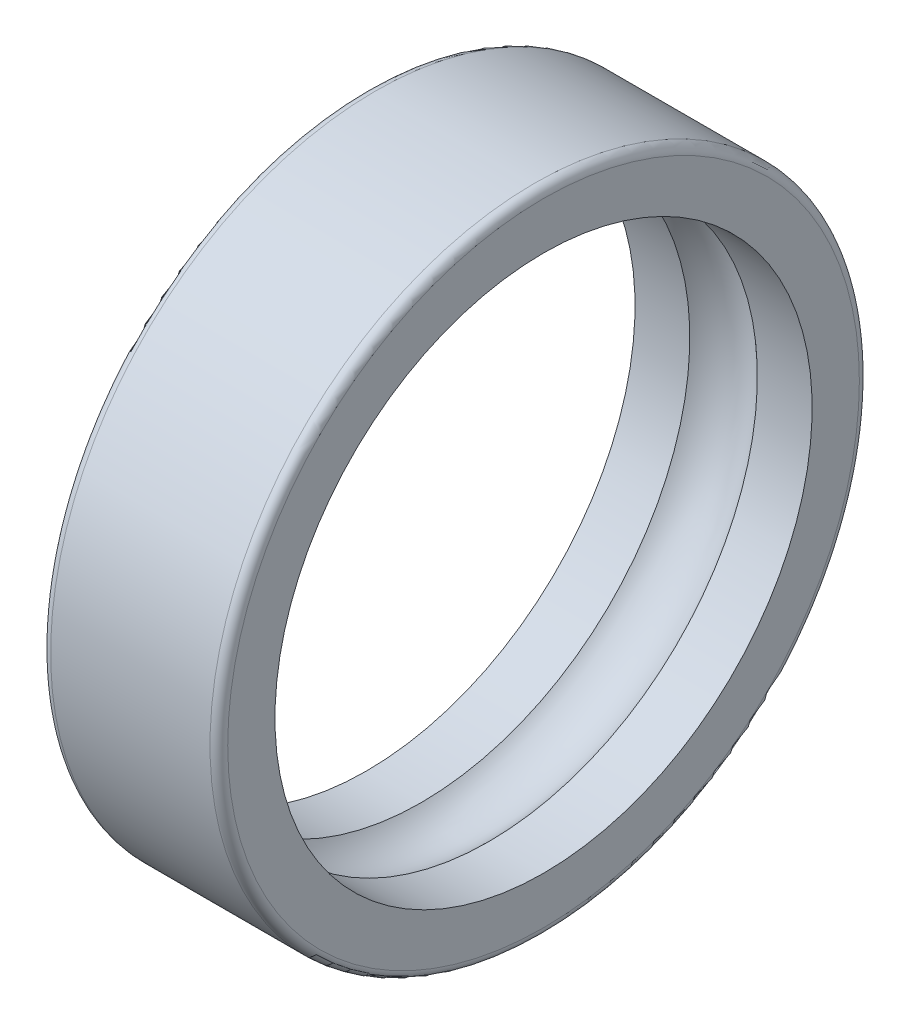
ISO-10303-21;
HEADER;
FILE_DESCRIPTION(('STEP AP214'),'2;1');
FILE_NAME('part.step','',(''),(''),'','','');
FILE_SCHEMA(('AUTOMOTIVE_DESIGN { 1 0 10303 214 1 1 1 1 }'));
ENDSEC;
DATA;
#1=APPLICATION_CONTEXT('core data for automotive mechanical design processes');
#2=APPLICATION_PROTOCOL_DEFINITION('international standard','automotive_design',2000,#1);
#3=PRODUCT_CONTEXT('',#1,'mechanical');
#4=PRODUCT('Part','Part','',(#3));
#5=PRODUCT_RELATED_PRODUCT_CATEGORY('part','',(#4));
#6=PRODUCT_DEFINITION_FORMATION('','',#4);
#7=PRODUCT_DEFINITION_CONTEXT('part definition',#1,'design');
#8=PRODUCT_DEFINITION('design','',#6,#7);
#9=PRODUCT_DEFINITION_SHAPE('','',#8);
#10=(LENGTH_UNIT() NAMED_UNIT(*) SI_UNIT(.MILLI.,.METRE.));
#11=(NAMED_UNIT(*) PLANE_ANGLE_UNIT() SI_UNIT($,.RADIAN.));
#12=(NAMED_UNIT(*) SI_UNIT($,.STERADIAN.) SOLID_ANGLE_UNIT());
#13=UNCERTAINTY_MEASURE_WITH_UNIT(LENGTH_MEASURE(1.E-05),#10,'distance_accuracy_value','');
#14=(GEOMETRIC_REPRESENTATION_CONTEXT(3) GLOBAL_UNCERTAINTY_ASSIGNED_CONTEXT((#13)) GLOBAL_UNIT_ASSIGNED_CONTEXT((#10,
#11,#12)) REPRESENTATION_CONTEXT('',''));
#15=CARTESIAN_POINT('',(0.,0.,0.));
#16=DIRECTION('',(0.,0.,1.));
#17=DIRECTION('',(1.,0.,0.));
#18=AXIS2_PLACEMENT_3D('',#15,#16,#17);
#19=CARTESIAN_POINT('',(5.07231028516007,0.,0.));
#20=DIRECTION('',(-1.,0.,0.));
#21=DIRECTION('',(0.,1.,0.));
#22=AXIS2_PLACEMENT_3D('',#19,#20,#21);
#23=CYLINDRICAL_SURFACE('',#22,9.1);
#24=CARTESIAN_POINT('',(6.,0.,0.));
#25=DIRECTION('',(1.,0.,0.));
#26=DIRECTION('',(0.,1.,0.));
#27=AXIS2_PLACEMENT_3D('',#24,#25,#26);
#28=CIRCLE('',#27,9.1);
#29=CARTESIAN_POINT('',(6.,9.1,0.));
#30=VERTEX_POINT('',#29);
#31=EDGE_CURVE('E11',#30,#30,#28,.T.);
#32=ORIENTED_EDGE('',*,*,#31,.T.);
#33=EDGE_LOOP('',(#32));
#34=FACE_BOUND('',#33,.T.);
#35=CARTESIAN_POINT('',(4.14462057032014,0.,0.));
#36=DIRECTION('',(1.,0.,0.));
#37=DIRECTION('',(0.,1.,0.));
#38=AXIS2_PLACEMENT_3D('',#35,#36,#37);
#39=CIRCLE('',#38,9.1);
#40=CARTESIAN_POINT('',(4.14462057032014,9.1,0.));
#41=VERTEX_POINT('',#40);
#42=EDGE_CURVE('E58',#41,#41,#39,.T.);
#43=ORIENTED_EDGE('',*,*,#42,.F.);
#44=EDGE_LOOP('',(#43));
#45=FACE_BOUND('',#44,.T.);
#46=ADVANCED_FACE('F16',(#34,#45),#23,.F.);
#47=CARTESIAN_POINT('',(6.,9.9,0.));
#48=DIRECTION('',(1.,0.,0.));
#49=DIRECTION('',(0.,1.,0.));
#50=AXIS2_PLACEMENT_3D('',#47,#48,#49);
#51=PLANE('',#50);
#52=CARTESIAN_POINT('',(6.,0.,0.));
#53=DIRECTION('',(1.,0.,0.));
#54=DIRECTION('',(0.,1.,0.));
#55=AXIS2_PLACEMENT_3D('',#52,#53,#54);
#56=CIRCLE('',#55,10.7);
#57=CARTESIAN_POINT('',(6.,10.7,0.));
#58=VERTEX_POINT('',#57);
#59=EDGE_CURVE('E26',#58,#58,#56,.T.);
#60=ORIENTED_EDGE('',*,*,#59,.T.);
#61=EDGE_LOOP('',(#60));
#62=FACE_BOUND('',#61,.T.);
#63=ORIENTED_EDGE('',*,*,#31,.F.);
#64=EDGE_LOOP('',(#63));
#65=FACE_BOUND('',#64,.T.);
#66=ADVANCED_FACE('F74',(#62,#65),#51,.T.);
#67=CARTESIAN_POINT('',(5.7,0.,0.));
#68=DIRECTION('',(1.,0.,0.));
#69=DIRECTION('',(0.,0.,-1.));
#70=AXIS2_PLACEMENT_3D('',#67,#68,#69);
#71=TOROIDAL_SURFACE('',#70,10.7,0.3);
#72=CARTESIAN_POINT('',(5.7,0.,0.));
#73=DIRECTION('',(1.,0.,0.));
#74=DIRECTION('',(0.,1.,0.));
#75=AXIS2_PLACEMENT_3D('',#72,#73,#74);
#76=CIRCLE('',#75,11.);
#77=CARTESIAN_POINT('',(5.7,11.,0.));
#78=VERTEX_POINT('',#77);
#79=EDGE_CURVE('E42',#78,#78,#76,.T.);
#80=ORIENTED_EDGE('',*,*,#79,.T.);
#81=EDGE_LOOP('',(#80));
#82=FACE_BOUND('',#81,.T.);
#83=ORIENTED_EDGE('',*,*,#59,.F.);
#84=EDGE_LOOP('',(#83));
#85=FACE_BOUND('',#84,.T.);
#86=ADVANCED_FACE('F77',(#82,#85),#71,.T.);
#87=CARTESIAN_POINT('',(3.,0.,0.));
#88=DIRECTION('',(-1.,0.,0.));
#89=DIRECTION('',(0.,1.,0.));
#90=AXIS2_PLACEMENT_3D('',#87,#88,#89);
#91=CYLINDRICAL_SURFACE('',#90,11.);
#92=CARTESIAN_POINT('',(0.3,0.,0.));
#93=DIRECTION('',(1.,0.,0.));
#94=DIRECTION('',(0.,1.,0.));
#95=AXIS2_PLACEMENT_3D('',#92,#93,#94);
#96=CIRCLE('',#95,11.);
#97=CARTESIAN_POINT('',(0.3,11.,0.));
#98=VERTEX_POINT('',#97);
#99=EDGE_CURVE('E20',#98,#98,#96,.T.);
#100=ORIENTED_EDGE('',*,*,#99,.T.);
#101=EDGE_LOOP('',(#100));
#102=FACE_BOUND('',#101,.T.);
#103=ORIENTED_EDGE('',*,*,#79,.F.);
#104=EDGE_LOOP('',(#103));
#105=FACE_BOUND('',#104,.T.);
#106=ADVANCED_FACE('F18',(#102,#105),#91,.T.);
#107=CARTESIAN_POINT('',(0.3,0.,0.));
#108=DIRECTION('',(1.,0.,0.));
#109=DIRECTION('',(0.,0.,-1.));
#110=AXIS2_PLACEMENT_3D('',#107,#108,#109);
#111=TOROIDAL_SURFACE('',#110,10.7,0.3);
#112=CARTESIAN_POINT('',(0.,0.,0.));
#113=DIRECTION('',(1.,0.,0.));
#114=DIRECTION('',(0.,1.,0.));
#115=AXIS2_PLACEMENT_3D('',#112,#113,#114);
#116=CIRCLE('',#115,10.7);
#117=CARTESIAN_POINT('',(0.,10.7,0.));
#118=VERTEX_POINT('',#117);
#119=EDGE_CURVE('E66',#118,#118,#116,.T.);
#120=ORIENTED_EDGE('',*,*,#119,.T.);
#121=EDGE_LOOP('',(#120));
#122=FACE_BOUND('',#121,.T.);
#123=ORIENTED_EDGE('',*,*,#99,.F.);
#124=EDGE_LOOP('',(#123));
#125=FACE_BOUND('',#124,.T.);
#126=ADVANCED_FACE('F85',(#122,#125),#111,.T.);
#127=CARTESIAN_POINT('',(0.,9.9,0.));
#128=DIRECTION('',(-1.,0.,0.));
#129=DIRECTION('',(0.,-1.,0.));
#130=AXIS2_PLACEMENT_3D('',#127,#128,#129);
#131=PLANE('',#130);
#132=CARTESIAN_POINT('',(0.,0.,0.));
#133=DIRECTION('',(1.,0.,0.));
#134=DIRECTION('',(0.,1.,0.));
#135=AXIS2_PLACEMENT_3D('',#132,#133,#134);
#136=CIRCLE('',#135,9.1);
#137=CARTESIAN_POINT('',(0.,9.1,0.));
#138=VERTEX_POINT('',#137);
#139=EDGE_CURVE('E62',#138,#138,#136,.T.);
#140=ORIENTED_EDGE('',*,*,#139,.T.);
#141=EDGE_LOOP('',(#140));
#142=FACE_BOUND('',#141,.T.);
#143=ORIENTED_EDGE('',*,*,#119,.F.);
#144=EDGE_LOOP('',(#143));
#145=FACE_BOUND('',#144,.T.);
#146=ADVANCED_FACE('F63',(#142,#145),#131,.T.);
#147=CARTESIAN_POINT('',(0.92768971483993,0.,0.));
#148=DIRECTION('',(-1.,0.,0.));
#149=DIRECTION('',(0.,1.,0.));
#150=AXIS2_PLACEMENT_3D('',#147,#148,#149);
#151=CYLINDRICAL_SURFACE('',#150,9.1);
#152=CARTESIAN_POINT('',(1.85537942967986,0.,0.));
#153=DIRECTION('',(1.,0.,0.));
#154=DIRECTION('',(0.,1.,0.));
#155=AXIS2_PLACEMENT_3D('',#152,#153,#154);
#156=CIRCLE('',#155,9.1);
#157=CARTESIAN_POINT('',(1.85537942967986,9.1,0.));
#158=VERTEX_POINT('',#157);
#159=EDGE_CURVE('E54',#158,#158,#156,.T.);
#160=ORIENTED_EDGE('',*,*,#159,.T.);
#161=EDGE_LOOP('',(#160));
#162=FACE_BOUND('',#161,.T.);
#163=ORIENTED_EDGE('',*,*,#139,.F.);
#164=EDGE_LOOP('',(#163));
#165=FACE_BOUND('',#164,.T.);
#166=ADVANCED_FACE('F100',(#162,#165),#151,.F.);
#167=CARTESIAN_POINT('',(3.,0.,0.));
#168=DIRECTION('',(1.,0.,0.));
#169=DIRECTION('',(0.,0.,-1.));
#170=AXIS2_PLACEMENT_3D('',#167,#168,#169);
#171=TOROIDAL_SURFACE('',#170,8.,1.5875);
#172=ORIENTED_EDGE('',*,*,#42,.T.);
#173=EDGE_LOOP('',(#172));
#174=FACE_BOUND('',#173,.T.);
#175=ORIENTED_EDGE('',*,*,#159,.F.);
#176=EDGE_LOOP('',(#175));
#177=FACE_BOUND('',#176,.T.);
#178=ADVANCED_FACE('F106',(#174,#177),#171,.F.);
#179=CLOSED_SHELL('',(#46,#66,#86,#106,#126,#146,#166,#178));
#180=MANIFOLD_SOLID_BREP('B1',#179);
#181=ADVANCED_BREP_SHAPE_REPRESENTATION('',(#18,#180),#14);
#182=SHAPE_DEFINITION_REPRESENTATION(#9,#181);
ENDSEC;
END-ISO-10303-21;
